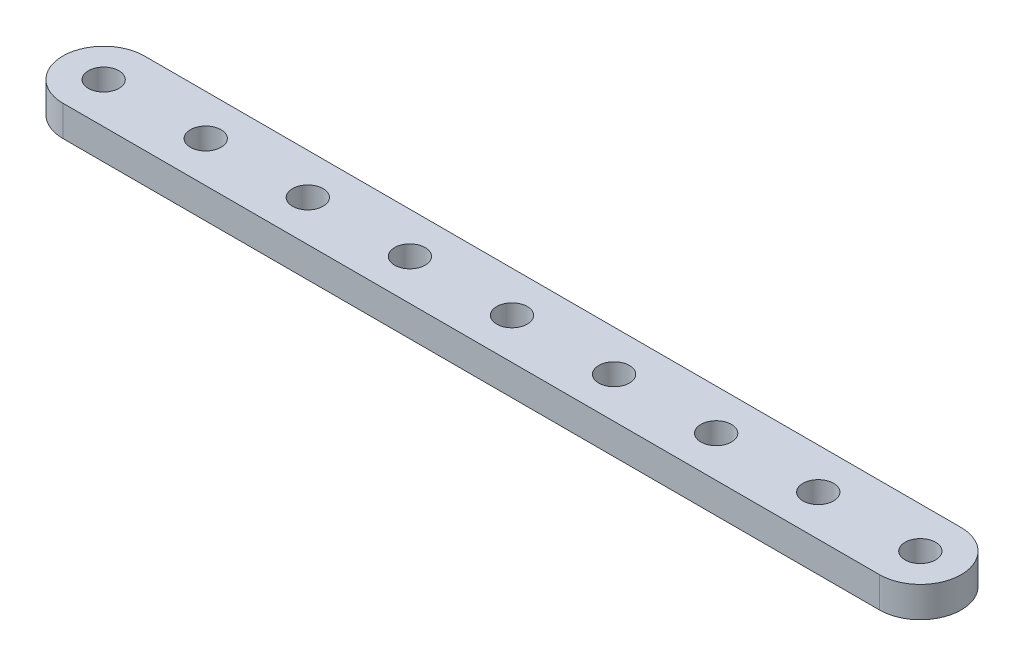
ISO-10303-21;
HEADER;
FILE_DESCRIPTION(('STEP AP214'),'2;1');
FILE_NAME('part.step','',(''),(''),'','','');
FILE_SCHEMA(('AUTOMOTIVE_DESIGN { 1 0 10303 214 1 1 1 1 }'));
ENDSEC;
DATA;
#1=APPLICATION_CONTEXT('core data for automotive mechanical design processes');
#2=APPLICATION_PROTOCOL_DEFINITION('international standard','automotive_design',2000,#1);
#3=PRODUCT_CONTEXT('',#1,'mechanical');
#4=PRODUCT('Part','Part','',(#3));
#5=PRODUCT_RELATED_PRODUCT_CATEGORY('part','',(#4));
#6=PRODUCT_DEFINITION_FORMATION('','',#4);
#7=PRODUCT_DEFINITION_CONTEXT('part definition',#1,'design');
#8=PRODUCT_DEFINITION('design','',#6,#7);
#9=PRODUCT_DEFINITION_SHAPE('','',#8);
#10=(LENGTH_UNIT() NAMED_UNIT(*) SI_UNIT(.MILLI.,.METRE.));
#11=(NAMED_UNIT(*) PLANE_ANGLE_UNIT() SI_UNIT($,.RADIAN.));
#12=(NAMED_UNIT(*) SI_UNIT($,.STERADIAN.) SOLID_ANGLE_UNIT());
#13=UNCERTAINTY_MEASURE_WITH_UNIT(LENGTH_MEASURE(1.E-05),#10,'distance_accuracy_value','');
#14=(GEOMETRIC_REPRESENTATION_CONTEXT(3) GLOBAL_UNCERTAINTY_ASSIGNED_CONTEXT((#13)) GLOBAL_UNIT_ASSIGNED_CONTEXT((#10,
#11,#12)) REPRESENTATION_CONTEXT('',''));
#15=CARTESIAN_POINT('',(0.,0.,0.));
#16=DIRECTION('',(0.,0.,1.));
#17=DIRECTION('',(1.,0.,0.));
#18=AXIS2_PLACEMENT_3D('',#15,#16,#17);
#19=CARTESIAN_POINT('',(-10.,3.,0.));
#20=DIRECTION('',(0.,-1.,0.));
#21=DIRECTION('',(0.,0.,-1.));
#22=AXIS2_PLACEMENT_3D('',#19,#20,#21);
#23=CYLINDRICAL_SURFACE('',#22,4.);
#24=CARTESIAN_POINT('',(-10.,0.,0.));
#25=DIRECTION('',(0.,1.,0.));
#26=DIRECTION('',(0.,0.,1.));
#27=AXIS2_PLACEMENT_3D('',#24,#25,#26);
#28=CIRCLE('',#27,4.);
#29=CARTESIAN_POINT('',(-10.,0.,-4.));
#30=VERTEX_POINT('',#29);
#31=CARTESIAN_POINT('',(-10.,0.,4.));
#32=VERTEX_POINT('',#31);
#33=EDGE_CURVE('E100',#30,#32,#28,.T.);
#34=ORIENTED_EDGE('',*,*,#33,.T.);
#35=DIRECTION('',(0.,-1.,0.));
#36=VECTOR('',#35,1.);
#37=CARTESIAN_POINT('',(-10.,3.,4.));
#38=LINE('',#37,#36);
#39=CARTESIAN_POINT('',(-10.,3.,4.));
#40=VERTEX_POINT('',#39);
#41=EDGE_CURVE('E11',#40,#32,#38,.T.);
#42=ORIENTED_EDGE('',*,*,#41,.F.);
#43=CARTESIAN_POINT('',(-10.,3.,0.));
#44=DIRECTION('',(0.,1.,0.));
#45=DIRECTION('',(0.,0.,1.));
#46=AXIS2_PLACEMENT_3D('',#43,#44,#45);
#47=CIRCLE('',#46,4.);
#48=CARTESIAN_POINT('',(-10.,3.,-4.));
#49=VERTEX_POINT('',#48);
#50=EDGE_CURVE('E86',#49,#40,#47,.T.);
#51=ORIENTED_EDGE('',*,*,#50,.F.);
#52=DIRECTION('',(0.,-1.,0.));
#53=VECTOR('',#52,1.);
#54=CARTESIAN_POINT('',(-10.,3.,-4.));
#55=LINE('',#54,#53);
#56=EDGE_CURVE('E53',#49,#30,#55,.T.);
#57=ORIENTED_EDGE('',*,*,#56,.T.);
#58=EDGE_LOOP('',(#34,#42,#51,#57));
#59=FACE_BOUND('',#58,.T.);
#60=ADVANCED_FACE('F37',(#59),#23,.T.);
#61=CARTESIAN_POINT('',(-10.,3.,4.));
#62=DIRECTION('',(0.,0.,-1.));
#63=DIRECTION('',(-1.,0.,0.));
#64=AXIS2_PLACEMENT_3D('',#61,#62,#63);
#65=PLANE('',#64);
#66=DIRECTION('',(1.,0.,0.));
#67=VECTOR('',#66,1.);
#68=CARTESIAN_POINT('',(-10.,0.,4.));
#69=LINE('',#68,#67);
#70=CARTESIAN_POINT('',(70.,0.,4.));
#71=VERTEX_POINT('',#70);
#72=EDGE_CURVE('E91',#32,#71,#69,.T.);
#73=ORIENTED_EDGE('',*,*,#72,.T.);
#74=DIRECTION('',(0.,-1.,0.));
#75=VECTOR('',#74,1.);
#76=CARTESIAN_POINT('',(70.,3.,4.));
#77=LINE('',#76,#75);
#78=CARTESIAN_POINT('',(70.,3.,4.));
#79=VERTEX_POINT('',#78);
#80=EDGE_CURVE('E45',#79,#71,#77,.T.);
#81=ORIENTED_EDGE('',*,*,#80,.F.);
#82=DIRECTION('',(1.,0.,0.));
#83=VECTOR('',#82,1.);
#84=CARTESIAN_POINT('',(-10.,3.,4.));
#85=LINE('',#84,#83);
#86=EDGE_CURVE('E78',#40,#79,#85,.T.);
#87=ORIENTED_EDGE('',*,*,#86,.F.);
#88=ORIENTED_EDGE('',*,*,#41,.T.);
#89=EDGE_LOOP('',(#73,#81,#87,#88));
#90=FACE_BOUND('',#89,.T.);
#91=ADVANCED_FACE('F90',(#90),#65,.F.);
#92=CARTESIAN_POINT('',(70.,3.,0.));
#93=DIRECTION('',(0.,-1.,0.));
#94=DIRECTION('',(0.,0.,-1.));
#95=AXIS2_PLACEMENT_3D('',#92,#93,#94);
#96=CYLINDRICAL_SURFACE('',#95,4.);
#97=CARTESIAN_POINT('',(70.,0.,0.));
#98=DIRECTION('',(0.,-1.,0.));
#99=DIRECTION('',(0.,0.,-1.));
#100=AXIS2_PLACEMENT_3D('',#97,#98,#99);
#101=CIRCLE('',#100,4.);
#102=CARTESIAN_POINT('',(70.,0.,-4.));
#103=VERTEX_POINT('',#102);
#104=EDGE_CURVE('E104',#103,#71,#101,.T.);
#105=ORIENTED_EDGE('',*,*,#104,.F.);
#106=DIRECTION('',(0.,-1.,0.));
#107=VECTOR('',#106,1.);
#108=CARTESIAN_POINT('',(70.,3.,-4.));
#109=LINE('',#108,#107);
#110=CARTESIAN_POINT('',(70.,3.,-4.));
#111=VERTEX_POINT('',#110);
#112=EDGE_CURVE('E67',#111,#103,#109,.T.);
#113=ORIENTED_EDGE('',*,*,#112,.F.);
#114=CARTESIAN_POINT('',(70.,3.,0.));
#115=DIRECTION('',(0.,-1.,0.));
#116=DIRECTION('',(0.,0.,-1.));
#117=AXIS2_PLACEMENT_3D('',#114,#115,#116);
#118=CIRCLE('',#117,4.);
#119=EDGE_CURVE('E85',#111,#79,#118,.T.);
#120=ORIENTED_EDGE('',*,*,#119,.T.);
#121=ORIENTED_EDGE('',*,*,#80,.T.);
#122=EDGE_LOOP('',(#105,#113,#120,#121));
#123=FACE_BOUND('',#122,.T.);
#124=ADVANCED_FACE('F94',(#123),#96,.T.);
#125=CARTESIAN_POINT('',(-10.,3.,-4.));
#126=DIRECTION('',(0.,0.,-1.));
#127=DIRECTION('',(-1.,0.,0.));
#128=AXIS2_PLACEMENT_3D('',#125,#126,#127);
#129=PLANE('',#128);
#130=DIRECTION('',(1.,0.,0.));
#131=VECTOR('',#130,1.);
#132=CARTESIAN_POINT('',(-10.,0.,-4.));
#133=LINE('',#132,#131);
#134=EDGE_CURVE('E106',#30,#103,#133,.T.);
#135=ORIENTED_EDGE('',*,*,#134,.F.);
#136=ORIENTED_EDGE('',*,*,#56,.F.);
#137=DIRECTION('',(1.,0.,0.));
#138=VECTOR('',#137,1.);
#139=CARTESIAN_POINT('',(-10.,3.,-4.));
#140=LINE('',#139,#138);
#141=EDGE_CURVE('E95',#49,#111,#140,.T.);
#142=ORIENTED_EDGE('',*,*,#141,.T.);
#143=ORIENTED_EDGE('',*,*,#112,.T.);
#144=EDGE_LOOP('',(#135,#136,#142,#143));
#145=FACE_BOUND('',#144,.T.);
#146=ADVANCED_FACE('F178',(#145),#129,.T.);
#147=CARTESIAN_POINT('',(-10.,3.,0.));
#148=DIRECTION('',(0.,1.,0.));
#149=DIRECTION('',(0.,0.,1.));
#150=AXIS2_PLACEMENT_3D('',#147,#148,#149);
#151=PLANE('',#150);
#152=CARTESIAN_POINT('',(-10.,3.,0.));
#153=DIRECTION('',(0.,1.,0.));
#154=DIRECTION('',(0.,0.,1.));
#155=AXIS2_PLACEMENT_3D('',#152,#153,#154);
#156=CIRCLE('',#155,1.5);
#157=CARTESIAN_POINT('',(-10.,3.,1.5));
#158=VERTEX_POINT('',#157);
#159=EDGE_CURVE('E137',#158,#158,#156,.T.);
#160=ORIENTED_EDGE('',*,*,#159,.F.);
#161=EDGE_LOOP('',(#160));
#162=FACE_BOUND('',#161,.T.);
#163=CARTESIAN_POINT('',(40.,3.,0.));
#164=DIRECTION('',(0.,1.,0.));
#165=DIRECTION('',(0.,0.,1.));
#166=AXIS2_PLACEMENT_3D('',#163,#164,#165);
#167=CIRCLE('',#166,1.5);
#168=CARTESIAN_POINT('',(40.,3.,1.5));
#169=VERTEX_POINT('',#168);
#170=EDGE_CURVE('E138',#169,#169,#167,.T.);
#171=ORIENTED_EDGE('',*,*,#170,.F.);
#172=EDGE_LOOP('',(#171));
#173=FACE_BOUND('',#172,.T.);
#174=CARTESIAN_POINT('',(30.,3.,0.));
#175=DIRECTION('',(0.,1.,0.));
#176=DIRECTION('',(0.,0.,1.));
#177=AXIS2_PLACEMENT_3D('',#174,#175,#176);
#178=CIRCLE('',#177,1.5);
#179=CARTESIAN_POINT('',(30.,3.,1.5));
#180=VERTEX_POINT('',#179);
#181=EDGE_CURVE('E144',#180,#180,#178,.T.);
#182=ORIENTED_EDGE('',*,*,#181,.F.);
#183=EDGE_LOOP('',(#182));
#184=FACE_BOUND('',#183,.T.);
#185=CARTESIAN_POINT('',(20.,3.,0.));
#186=DIRECTION('',(0.,1.,0.));
#187=DIRECTION('',(0.,0.,1.));
#188=AXIS2_PLACEMENT_3D('',#185,#186,#187);
#189=CIRCLE('',#188,1.5);
#190=CARTESIAN_POINT('',(20.,3.,1.5));
#191=VERTEX_POINT('',#190);
#192=EDGE_CURVE('E150',#191,#191,#189,.T.);
#193=ORIENTED_EDGE('',*,*,#192,.F.);
#194=EDGE_LOOP('',(#193));
#195=FACE_BOUND('',#194,.T.);
#196=CARTESIAN_POINT('',(10.,3.,0.));
#197=DIRECTION('',(0.,1.,0.));
#198=DIRECTION('',(0.,0.,1.));
#199=AXIS2_PLACEMENT_3D('',#196,#197,#198);
#200=CIRCLE('',#199,1.5);
#201=CARTESIAN_POINT('',(10.,3.,1.5));
#202=VERTEX_POINT('',#201);
#203=EDGE_CURVE('E156',#202,#202,#200,.T.);
#204=ORIENTED_EDGE('',*,*,#203,.F.);
#205=EDGE_LOOP('',(#204));
#206=FACE_BOUND('',#205,.T.);
#207=CARTESIAN_POINT('',(60.,3.,0.));
#208=DIRECTION('',(0.,1.,0.));
#209=DIRECTION('',(0.,0.,1.));
#210=AXIS2_PLACEMENT_3D('',#207,#208,#209);
#211=CIRCLE('',#210,1.5);
#212=CARTESIAN_POINT('',(60.,3.,1.5));
#213=VERTEX_POINT('',#212);
#214=EDGE_CURVE('E112',#213,#213,#211,.T.);
#215=ORIENTED_EDGE('',*,*,#214,.F.);
#216=EDGE_LOOP('',(#215));
#217=FACE_BOUND('',#216,.T.);
#218=CARTESIAN_POINT('',(70.,3.,0.));
#219=DIRECTION('',(0.,1.,0.));
#220=DIRECTION('',(0.,0.,1.));
#221=AXIS2_PLACEMENT_3D('',#218,#219,#220);
#222=CIRCLE('',#221,1.5);
#223=CARTESIAN_POINT('',(70.,3.,1.5));
#224=VERTEX_POINT('',#223);
#225=EDGE_CURVE('E119',#224,#224,#222,.T.);
#226=ORIENTED_EDGE('',*,*,#225,.F.);
#227=EDGE_LOOP('',(#226));
#228=FACE_BOUND('',#227,.T.);
#229=CARTESIAN_POINT('',(50.,3.,0.));
#230=DIRECTION('',(0.,1.,0.));
#231=DIRECTION('',(0.,0.,1.));
#232=AXIS2_PLACEMENT_3D('',#229,#230,#231);
#233=CIRCLE('',#232,1.5);
#234=CARTESIAN_POINT('',(50.,3.,1.5));
#235=VERTEX_POINT('',#234);
#236=EDGE_CURVE('E125',#235,#235,#233,.T.);
#237=ORIENTED_EDGE('',*,*,#236,.F.);
#238=EDGE_LOOP('',(#237));
#239=FACE_BOUND('',#238,.T.);
#240=CARTESIAN_POINT('',(0.,3.,0.));
#241=DIRECTION('',(0.,1.,0.));
#242=DIRECTION('',(0.,0.,1.));
#243=AXIS2_PLACEMENT_3D('',#240,#241,#242);
#244=CIRCLE('',#243,1.5);
#245=CARTESIAN_POINT('',(0.,3.,1.5));
#246=VERTEX_POINT('',#245);
#247=EDGE_CURVE('E131',#246,#246,#244,.T.);
#248=ORIENTED_EDGE('',*,*,#247,.F.);
#249=EDGE_LOOP('',(#248));
#250=FACE_BOUND('',#249,.T.);
#251=ORIENTED_EDGE('',*,*,#50,.T.);
#252=ORIENTED_EDGE('',*,*,#86,.T.);
#253=ORIENTED_EDGE('',*,*,#119,.F.);
#254=ORIENTED_EDGE('',*,*,#141,.F.);
#255=EDGE_LOOP('',(#251,#252,#253,#254));
#256=FACE_BOUND('',#255,.T.);
#257=ADVANCED_FACE('F82',(#162,#173,#184,#195,#206,#217,#228,#239,#250,#256),#151,.T.);
#258=CARTESIAN_POINT('',(-10.,0.,0.));
#259=DIRECTION('',(0.,1.,0.));
#260=DIRECTION('',(0.,0.,1.));
#261=AXIS2_PLACEMENT_3D('',#258,#259,#260);
#262=PLANE('',#261);
#263=CARTESIAN_POINT('',(-10.,0.,0.));
#264=DIRECTION('',(0.,1.,0.));
#265=DIRECTION('',(0.,0.,1.));
#266=AXIS2_PLACEMENT_3D('',#263,#264,#265);
#267=CIRCLE('',#266,1.5);
#268=CARTESIAN_POINT('',(-10.,0.,1.5));
#269=VERTEX_POINT('',#268);
#270=EDGE_CURVE('E102',#269,#269,#267,.T.);
#271=ORIENTED_EDGE('',*,*,#270,.T.);
#272=EDGE_LOOP('',(#271));
#273=FACE_BOUND('',#272,.T.);
#274=CARTESIAN_POINT('',(40.,0.,0.));
#275=DIRECTION('',(0.,1.,0.));
#276=DIRECTION('',(0.,0.,1.));
#277=AXIS2_PLACEMENT_3D('',#274,#275,#276);
#278=CIRCLE('',#277,1.5);
#279=CARTESIAN_POINT('',(40.,0.,1.5));
#280=VERTEX_POINT('',#279);
#281=EDGE_CURVE('E141',#280,#280,#278,.T.);
#282=ORIENTED_EDGE('',*,*,#281,.T.);
#283=EDGE_LOOP('',(#282));
#284=FACE_BOUND('',#283,.T.);
#285=CARTESIAN_POINT('',(30.,0.,0.));
#286=DIRECTION('',(0.,1.,0.));
#287=DIRECTION('',(0.,0.,1.));
#288=AXIS2_PLACEMENT_3D('',#285,#286,#287);
#289=CIRCLE('',#288,1.5);
#290=CARTESIAN_POINT('',(30.,0.,1.5));
#291=VERTEX_POINT('',#290);
#292=EDGE_CURVE('E147',#291,#291,#289,.T.);
#293=ORIENTED_EDGE('',*,*,#292,.T.);
#294=EDGE_LOOP('',(#293));
#295=FACE_BOUND('',#294,.T.);
#296=CARTESIAN_POINT('',(20.,0.,0.));
#297=DIRECTION('',(0.,1.,0.));
#298=DIRECTION('',(0.,0.,1.));
#299=AXIS2_PLACEMENT_3D('',#296,#297,#298);
#300=CIRCLE('',#299,1.5);
#301=CARTESIAN_POINT('',(20.,0.,1.5));
#302=VERTEX_POINT('',#301);
#303=EDGE_CURVE('E153',#302,#302,#300,.T.);
#304=ORIENTED_EDGE('',*,*,#303,.T.);
#305=EDGE_LOOP('',(#304));
#306=FACE_BOUND('',#305,.T.);
#307=CARTESIAN_POINT('',(10.,0.,0.));
#308=DIRECTION('',(0.,1.,0.));
#309=DIRECTION('',(0.,0.,1.));
#310=AXIS2_PLACEMENT_3D('',#307,#308,#309);
#311=CIRCLE('',#310,1.5);
#312=CARTESIAN_POINT('',(10.,0.,1.5));
#313=VERTEX_POINT('',#312);
#314=EDGE_CURVE('E116',#313,#313,#311,.T.);
#315=ORIENTED_EDGE('',*,*,#314,.T.);
#316=EDGE_LOOP('',(#315));
#317=FACE_BOUND('',#316,.T.);
#318=CARTESIAN_POINT('',(60.,0.,0.));
#319=DIRECTION('',(0.,1.,0.));
#320=DIRECTION('',(0.,0.,1.));
#321=AXIS2_PLACEMENT_3D('',#318,#319,#320);
#322=CIRCLE('',#321,1.5);
#323=CARTESIAN_POINT('',(60.,0.,1.5));
#324=VERTEX_POINT('',#323);
#325=EDGE_CURVE('E115',#324,#324,#322,.T.);
#326=ORIENTED_EDGE('',*,*,#325,.T.);
#327=EDGE_LOOP('',(#326));
#328=FACE_BOUND('',#327,.T.);
#329=CARTESIAN_POINT('',(70.,0.,0.));
#330=DIRECTION('',(0.,1.,0.));
#331=DIRECTION('',(0.,0.,1.));
#332=AXIS2_PLACEMENT_3D('',#329,#330,#331);
#333=CIRCLE('',#332,1.5);
#334=CARTESIAN_POINT('',(70.,0.,1.5));
#335=VERTEX_POINT('',#334);
#336=EDGE_CURVE('E122',#335,#335,#333,.T.);
#337=ORIENTED_EDGE('',*,*,#336,.T.);
#338=EDGE_LOOP('',(#337));
#339=FACE_BOUND('',#338,.T.);
#340=CARTESIAN_POINT('',(50.,0.,0.));
#341=DIRECTION('',(0.,1.,0.));
#342=DIRECTION('',(0.,0.,1.));
#343=AXIS2_PLACEMENT_3D('',#340,#341,#342);
#344=CIRCLE('',#343,1.5);
#345=CARTESIAN_POINT('',(50.,0.,1.5));
#346=VERTEX_POINT('',#345);
#347=EDGE_CURVE('E128',#346,#346,#344,.T.);
#348=ORIENTED_EDGE('',*,*,#347,.T.);
#349=EDGE_LOOP('',(#348));
#350=FACE_BOUND('',#349,.T.);
#351=CARTESIAN_POINT('',(0.,0.,0.));
#352=DIRECTION('',(0.,1.,0.));
#353=DIRECTION('',(0.,0.,1.));
#354=AXIS2_PLACEMENT_3D('',#351,#352,#353);
#355=CIRCLE('',#354,1.5);
#356=CARTESIAN_POINT('',(0.,0.,1.5));
#357=VERTEX_POINT('',#356);
#358=EDGE_CURVE('E134',#357,#357,#355,.T.);
#359=ORIENTED_EDGE('',*,*,#358,.T.);
#360=EDGE_LOOP('',(#359));
#361=FACE_BOUND('',#360,.T.);
#362=ORIENTED_EDGE('',*,*,#33,.F.);
#363=ORIENTED_EDGE('',*,*,#134,.T.);
#364=ORIENTED_EDGE('',*,*,#104,.T.);
#365=ORIENTED_EDGE('',*,*,#72,.F.);
#366=EDGE_LOOP('',(#362,#363,#364,#365));
#367=FACE_BOUND('',#366,.T.);
#368=ADVANCED_FACE('F166',(#273,#284,#295,#306,#317,#328,#339,#350,#361,#367),#262,.F.);
#369=CARTESIAN_POINT('',(0.,0.,0.));
#370=DIRECTION('',(0.,1.,0.));
#371=DIRECTION('',(0.,0.,1.));
#372=AXIS2_PLACEMENT_3D('',#369,#370,#371);
#373=CYLINDRICAL_SURFACE('',#372,1.5);
#374=ORIENTED_EDGE('',*,*,#358,.F.);
#375=EDGE_LOOP('',(#374));
#376=FACE_BOUND('',#375,.T.);
#377=ORIENTED_EDGE('',*,*,#247,.T.);
#378=EDGE_LOOP('',(#377));
#379=FACE_BOUND('',#378,.T.);
#380=ADVANCED_FACE('F196',(#376,#379),#373,.F.);
#381=CARTESIAN_POINT('',(50.,0.,0.));
#382=DIRECTION('',(0.,1.,0.));
#383=DIRECTION('',(0.,0.,1.));
#384=AXIS2_PLACEMENT_3D('',#381,#382,#383);
#385=CYLINDRICAL_SURFACE('',#384,1.5);
#386=ORIENTED_EDGE('',*,*,#347,.F.);
#387=EDGE_LOOP('',(#386));
#388=FACE_BOUND('',#387,.T.);
#389=ORIENTED_EDGE('',*,*,#236,.T.);
#390=EDGE_LOOP('',(#389));
#391=FACE_BOUND('',#390,.T.);
#392=ADVANCED_FACE('F198',(#388,#391),#385,.F.);
#393=CARTESIAN_POINT('',(70.,0.,0.));
#394=DIRECTION('',(0.,1.,0.));
#395=DIRECTION('',(0.,0.,1.));
#396=AXIS2_PLACEMENT_3D('',#393,#394,#395);
#397=CYLINDRICAL_SURFACE('',#396,1.5);
#398=ORIENTED_EDGE('',*,*,#336,.F.);
#399=EDGE_LOOP('',(#398));
#400=FACE_BOUND('',#399,.T.);
#401=ORIENTED_EDGE('',*,*,#225,.T.);
#402=EDGE_LOOP('',(#401));
#403=FACE_BOUND('',#402,.T.);
#404=ADVANCED_FACE('F205',(#400,#403),#397,.F.);
#405=CARTESIAN_POINT('',(60.,0.,0.));
#406=DIRECTION('',(0.,1.,0.));
#407=DIRECTION('',(0.,0.,1.));
#408=AXIS2_PLACEMENT_3D('',#405,#406,#407);
#409=CYLINDRICAL_SURFACE('',#408,1.5);
#410=ORIENTED_EDGE('',*,*,#325,.F.);
#411=EDGE_LOOP('',(#410));
#412=FACE_BOUND('',#411,.T.);
#413=ORIENTED_EDGE('',*,*,#214,.T.);
#414=EDGE_LOOP('',(#413));
#415=FACE_BOUND('',#414,.T.);
#416=ADVANCED_FACE('F222',(#412,#415),#409,.F.);
#417=CARTESIAN_POINT('',(10.,0.,0.));
#418=DIRECTION('',(0.,1.,0.));
#419=DIRECTION('',(0.,0.,1.));
#420=AXIS2_PLACEMENT_3D('',#417,#418,#419);
#421=CYLINDRICAL_SURFACE('',#420,1.5);
#422=ORIENTED_EDGE('',*,*,#314,.F.);
#423=EDGE_LOOP('',(#422));
#424=FACE_BOUND('',#423,.T.);
#425=ORIENTED_EDGE('',*,*,#203,.T.);
#426=EDGE_LOOP('',(#425));
#427=FACE_BOUND('',#426,.T.);
#428=ADVANCED_FACE('F225',(#424,#427),#421,.F.);
#429=CARTESIAN_POINT('',(20.,0.,0.));
#430=DIRECTION('',(0.,1.,0.));
#431=DIRECTION('',(0.,0.,1.));
#432=AXIS2_PLACEMENT_3D('',#429,#430,#431);
#433=CYLINDRICAL_SURFACE('',#432,1.5);
#434=ORIENTED_EDGE('',*,*,#303,.F.);
#435=EDGE_LOOP('',(#434));
#436=FACE_BOUND('',#435,.T.);
#437=ORIENTED_EDGE('',*,*,#192,.T.);
#438=EDGE_LOOP('',(#437));
#439=FACE_BOUND('',#438,.T.);
#440=ADVANCED_FACE('F250',(#436,#439),#433,.F.);
#441=CARTESIAN_POINT('',(30.,0.,0.));
#442=DIRECTION('',(0.,1.,0.));
#443=DIRECTION('',(0.,0.,1.));
#444=AXIS2_PLACEMENT_3D('',#441,#442,#443);
#445=CYLINDRICAL_SURFACE('',#444,1.5);
#446=ORIENTED_EDGE('',*,*,#292,.F.);
#447=EDGE_LOOP('',(#446));
#448=FACE_BOUND('',#447,.T.);
#449=ORIENTED_EDGE('',*,*,#181,.T.);
#450=EDGE_LOOP('',(#449));
#451=FACE_BOUND('',#450,.T.);
#452=ADVANCED_FACE('F258',(#448,#451),#445,.F.);
#453=CARTESIAN_POINT('',(40.,0.,0.));
#454=DIRECTION('',(0.,1.,0.));
#455=DIRECTION('',(0.,0.,1.));
#456=AXIS2_PLACEMENT_3D('',#453,#454,#455);
#457=CYLINDRICAL_SURFACE('',#456,1.5);
#458=ORIENTED_EDGE('',*,*,#281,.F.);
#459=EDGE_LOOP('',(#458));
#460=FACE_BOUND('',#459,.T.);
#461=ORIENTED_EDGE('',*,*,#170,.T.);
#462=EDGE_LOOP('',(#461));
#463=FACE_BOUND('',#462,.T.);
#464=ADVANCED_FACE('F172',(#460,#463),#457,.F.);
#465=CARTESIAN_POINT('',(-10.,0.,0.));
#466=DIRECTION('',(0.,1.,0.));
#467=DIRECTION('',(0.,0.,1.));
#468=AXIS2_PLACEMENT_3D('',#465,#466,#467);
#469=CYLINDRICAL_SURFACE('',#468,1.5);
#470=ORIENTED_EDGE('',*,*,#270,.F.);
#471=EDGE_LOOP('',(#470));
#472=FACE_BOUND('',#471,.T.);
#473=ORIENTED_EDGE('',*,*,#159,.T.);
#474=EDGE_LOOP('',(#473));
#475=FACE_BOUND('',#474,.T.);
#476=ADVANCED_FACE('F169',(#472,#475),#469,.F.);
#477=CLOSED_SHELL('',(#60,#91,#124,#146,#257,#368,#380,#392,#404,#416,#428,#440,#452,#464,#476));
#478=MANIFOLD_SOLID_BREP('B2',#477);
#479=ADVANCED_BREP_SHAPE_REPRESENTATION('',(#18,#478),#14);
#480=SHAPE_DEFINITION_REPRESENTATION(#9,#479);
ENDSEC;
END-ISO-10303-21;
